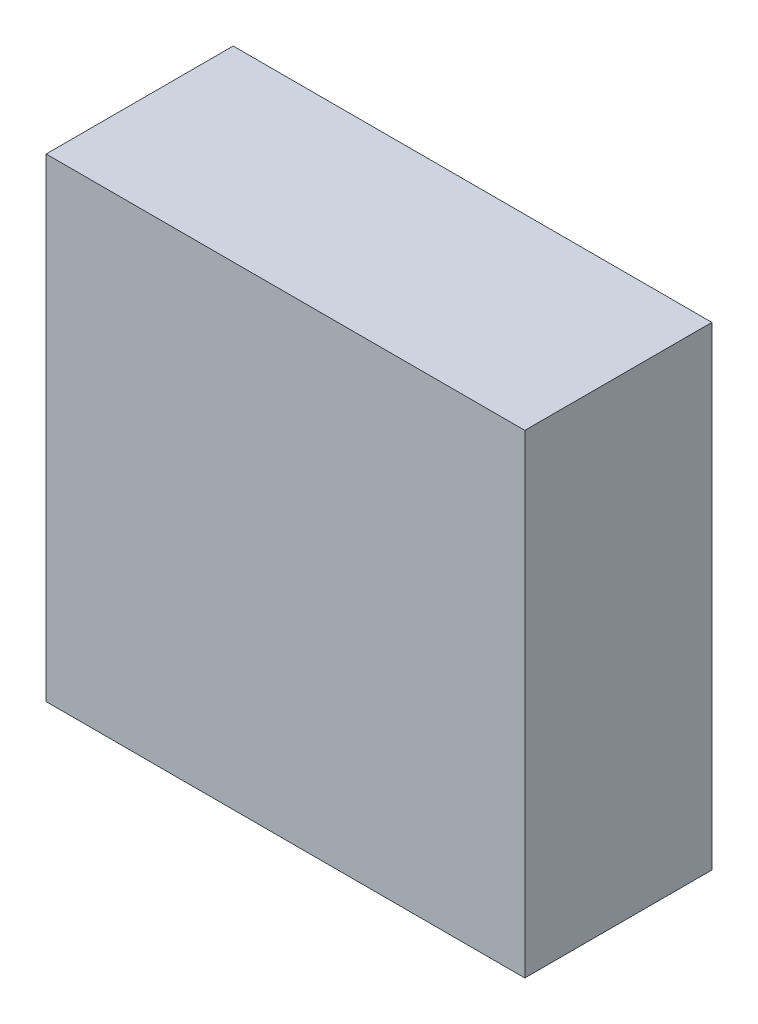
ISO-10303-21;
HEADER;
FILE_DESCRIPTION(('STEP AP214'),'2;1');
FILE_NAME('part.step','',(''),(''),'','','');
FILE_SCHEMA(('AUTOMOTIVE_DESIGN { 1 0 10303 214 1 1 1 1 }'));
ENDSEC;
DATA;
#1=APPLICATION_CONTEXT('core data for automotive mechanical design processes');
#2=APPLICATION_PROTOCOL_DEFINITION('international standard','automotive_design',2000,#1);
#3=PRODUCT_CONTEXT('',#1,'mechanical');
#4=PRODUCT('Part','Part','',(#3));
#5=PRODUCT_RELATED_PRODUCT_CATEGORY('part','',(#4));
#6=PRODUCT_DEFINITION_FORMATION('','',#4);
#7=PRODUCT_DEFINITION_CONTEXT('part definition',#1,'design');
#8=PRODUCT_DEFINITION('design','',#6,#7);
#9=PRODUCT_DEFINITION_SHAPE('','',#8);
#10=(LENGTH_UNIT() NAMED_UNIT(*) SI_UNIT(.MILLI.,.METRE.));
#11=(NAMED_UNIT(*) PLANE_ANGLE_UNIT() SI_UNIT($,.RADIAN.));
#12=(NAMED_UNIT(*) SI_UNIT($,.STERADIAN.) SOLID_ANGLE_UNIT());
#13=UNCERTAINTY_MEASURE_WITH_UNIT(LENGTH_MEASURE(1.E-05),#10,'distance_accuracy_value','');
#14=(GEOMETRIC_REPRESENTATION_CONTEXT(3) GLOBAL_UNCERTAINTY_ASSIGNED_CONTEXT((#13)) GLOBAL_UNIT_ASSIGNED_CONTEXT((#10,
#11,#12)) REPRESENTATION_CONTEXT('',''));
#15=CARTESIAN_POINT('',(0.,0.,0.));
#16=DIRECTION('',(0.,0.,1.));
#17=DIRECTION('',(1.,0.,0.));
#18=AXIS2_PLACEMENT_3D('',#15,#16,#17);
#19=CARTESIAN_POINT('',(-2.69999968,2.675001,2.11000086));
#20=DIRECTION('',(0.,0.,-1.));
#21=DIRECTION('',(-1.,0.,0.));
#22=AXIS2_PLACEMENT_3D('',#19,#20,#21);
#23=PLANE('',#22);
#24=DIRECTION('',(1.,0.,0.));
#25=VECTOR('',#24,1.);
#26=CARTESIAN_POINT('',(-2.69999968,-2.675001,2.11000086));
#27=LINE('',#26,#25);
#28=CARTESIAN_POINT('',(-2.69999968,-2.675001,2.11000086));
#29=VERTEX_POINT('',#28);
#30=CARTESIAN_POINT('',(2.69999968,-2.675001,2.11000086));
#31=VERTEX_POINT('',#30);
#32=EDGE_CURVE('E55',#29,#31,#27,.T.);
#33=ORIENTED_EDGE('',*,*,#32,.T.);
#34=DIRECTION('',(0.,1.,0.));
#35=VECTOR('',#34,1.);
#36=CARTESIAN_POINT('',(2.69999968,-2.675001,2.11000086));
#37=LINE('',#36,#35);
#38=CARTESIAN_POINT('',(2.69999968,2.675001,2.11000086));
#39=VERTEX_POINT('',#38);
#40=EDGE_CURVE('E57',#31,#39,#37,.T.);
#41=ORIENTED_EDGE('',*,*,#40,.T.);
#42=DIRECTION('',(1.,0.,0.));
#43=VECTOR('',#42,1.);
#44=CARTESIAN_POINT('',(2.69999968,2.675001,2.11000086));
#45=LINE('',#44,#43);
#46=CARTESIAN_POINT('',(-2.69999968,2.675001,2.11000086));
#47=VERTEX_POINT('',#46);
#48=EDGE_CURVE('E20',#39,#47,#45,.F.);
#49=ORIENTED_EDGE('',*,*,#48,.T.);
#50=DIRECTION('',(0.,1.,0.));
#51=VECTOR('',#50,1.);
#52=CARTESIAN_POINT('',(-2.69999968,2.675001,2.11000086));
#53=LINE('',#52,#51);
#54=EDGE_CURVE('E80',#47,#29,#53,.F.);
#55=ORIENTED_EDGE('',*,*,#54,.T.);
#56=EDGE_LOOP('',(#33,#41,#49,#55));
#57=FACE_BOUND('',#56,.T.);
#58=ADVANCED_FACE('F17',(#57),#23,.F.);
#59=CARTESIAN_POINT('',(2.69999968,2.675001,0.));
#60=DIRECTION('',(0.,-1.,0.));
#61=DIRECTION('',(0.,0.,-1.));
#62=AXIS2_PLACEMENT_3D('',#59,#60,#61);
#63=PLANE('',#62);
#64=DIRECTION('',(0.,0.,-1.));
#65=VECTOR('',#64,1.);
#66=CARTESIAN_POINT('',(-2.69999968,2.675001,0.));
#67=LINE('',#66,#65);
#68=CARTESIAN_POINT('',(-2.69999968,2.675001,0.));
#69=VERTEX_POINT('',#68);
#70=EDGE_CURVE('E68',#69,#47,#67,.F.);
#71=ORIENTED_EDGE('',*,*,#70,.T.);
#72=ORIENTED_EDGE('',*,*,#48,.F.);
#73=DIRECTION('',(0.,0.,1.));
#74=VECTOR('',#73,1.);
#75=CARTESIAN_POINT('',(2.69999968,2.675001,0.));
#76=LINE('',#75,#74);
#77=CARTESIAN_POINT('',(2.69999968,2.675001,0.));
#78=VERTEX_POINT('',#77);
#79=EDGE_CURVE('E63',#39,#78,#76,.F.);
#80=ORIENTED_EDGE('',*,*,#79,.T.);
#81=DIRECTION('',(-1.,0.,0.));
#82=VECTOR('',#81,1.);
#83=CARTESIAN_POINT('',(-2.69999968,2.675001,0.));
#84=LINE('',#83,#82);
#85=EDGE_CURVE('E83',#69,#78,#84,.F.);
#86=ORIENTED_EDGE('',*,*,#85,.F.);
#87=EDGE_LOOP('',(#71,#72,#80,#86));
#88=FACE_BOUND('',#87,.T.);
#89=ADVANCED_FACE('F65',(#88),#63,.F.);
#90=CARTESIAN_POINT('',(2.69999968,-2.675001,0.));
#91=DIRECTION('',(-1.,0.,0.));
#92=DIRECTION('',(0.,0.,1.));
#93=AXIS2_PLACEMENT_3D('',#90,#91,#92);
#94=PLANE('',#93);
#95=ORIENTED_EDGE('',*,*,#79,.F.);
#96=ORIENTED_EDGE('',*,*,#40,.F.);
#97=DIRECTION('',(0.,0.,1.));
#98=VECTOR('',#97,1.);
#99=CARTESIAN_POINT('',(2.69999968,-2.675001,0.));
#100=LINE('',#99,#98);
#101=CARTESIAN_POINT('',(2.69999968,-2.675001,0.));
#102=VERTEX_POINT('',#101);
#103=EDGE_CURVE('E75',#31,#102,#100,.F.);
#104=ORIENTED_EDGE('',*,*,#103,.T.);
#105=DIRECTION('',(0.,1.,0.));
#106=VECTOR('',#105,1.);
#107=CARTESIAN_POINT('',(2.69999968,2.675001,0.));
#108=LINE('',#107,#106);
#109=EDGE_CURVE('E72',#78,#102,#108,.F.);
#110=ORIENTED_EDGE('',*,*,#109,.F.);
#111=EDGE_LOOP('',(#95,#96,#104,#110));
#112=FACE_BOUND('',#111,.T.);
#113=ADVANCED_FACE('F70',(#112),#94,.F.);
#114=CARTESIAN_POINT('',(-2.69999968,-2.675001,0.));
#115=DIRECTION('',(0.,1.,0.));
#116=DIRECTION('',(0.,0.,1.));
#117=AXIS2_PLACEMENT_3D('',#114,#115,#116);
#118=PLANE('',#117);
#119=ORIENTED_EDGE('',*,*,#103,.F.);
#120=ORIENTED_EDGE('',*,*,#32,.F.);
#121=DIRECTION('',(0.,0.,-1.));
#122=VECTOR('',#121,1.);
#123=CARTESIAN_POINT('',(-2.69999968,-2.675001,0.));
#124=LINE('',#123,#122);
#125=CARTESIAN_POINT('',(-2.69999968,-2.675001,0.));
#126=VERTEX_POINT('',#125);
#127=EDGE_CURVE('E35',#29,#126,#124,.T.);
#128=ORIENTED_EDGE('',*,*,#127,.T.);
#129=DIRECTION('',(-1.,0.,0.));
#130=VECTOR('',#129,1.);
#131=CARTESIAN_POINT('',(-2.69999968,-2.675001,0.));
#132=LINE('',#131,#130);
#133=EDGE_CURVE('E26',#102,#126,#132,.T.);
#134=ORIENTED_EDGE('',*,*,#133,.F.);
#135=EDGE_LOOP('',(#119,#120,#128,#134));
#136=FACE_BOUND('',#135,.T.);
#137=ADVANCED_FACE('F89',(#136),#118,.F.);
#138=CARTESIAN_POINT('',(-2.69999968,2.675001,0.));
#139=DIRECTION('',(1.,0.,0.));
#140=DIRECTION('',(0.,0.,-1.));
#141=AXIS2_PLACEMENT_3D('',#138,#139,#140);
#142=PLANE('',#141);
#143=ORIENTED_EDGE('',*,*,#127,.F.);
#144=ORIENTED_EDGE('',*,*,#54,.F.);
#145=ORIENTED_EDGE('',*,*,#70,.F.);
#146=DIRECTION('',(0.,1.,0.));
#147=VECTOR('',#146,1.);
#148=CARTESIAN_POINT('',(-2.69999968,2.675001,0.));
#149=LINE('',#148,#147);
#150=EDGE_CURVE('E11',#126,#69,#149,.T.);
#151=ORIENTED_EDGE('',*,*,#150,.F.);
#152=EDGE_LOOP('',(#143,#144,#145,#151));
#153=FACE_BOUND('',#152,.T.);
#154=ADVANCED_FACE('F91',(#153),#142,.F.);
#155=CARTESIAN_POINT('',(-2.69999968,2.675001,0.));
#156=DIRECTION('',(0.,0.,-1.));
#157=DIRECTION('',(-1.,0.,0.));
#158=AXIS2_PLACEMENT_3D('',#155,#156,#157);
#159=PLANE('',#158);
#160=ORIENTED_EDGE('',*,*,#133,.T.);
#161=ORIENTED_EDGE('',*,*,#150,.T.);
#162=ORIENTED_EDGE('',*,*,#85,.T.);
#163=ORIENTED_EDGE('',*,*,#109,.T.);
#164=EDGE_LOOP('',(#160,#161,#162,#163));
#165=FACE_BOUND('',#164,.T.);
#166=ADVANCED_FACE('F88',(#165),#159,.T.);
#167=CLOSED_SHELL('',(#58,#89,#113,#137,#154,#166));
#168=MANIFOLD_SOLID_BREP('B1',#167);
#169=ADVANCED_BREP_SHAPE_REPRESENTATION('',(#18,#168),#14);
#170=SHAPE_DEFINITION_REPRESENTATION(#9,#169);
ENDSEC;
END-ISO-10303-21;
